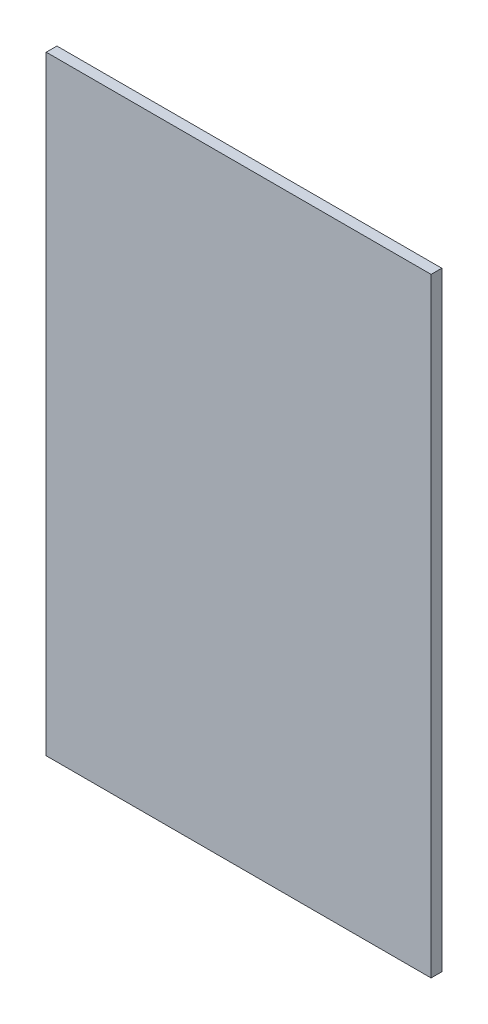
ISO-10303-21;
HEADER;
FILE_DESCRIPTION(('STEP AP214'),'2;1');
FILE_NAME('part.step','',(''),(''),'','','');
FILE_SCHEMA(('AUTOMOTIVE_DESIGN { 1 0 10303 214 1 1 1 1 }'));
ENDSEC;
DATA;
#1=APPLICATION_CONTEXT('core data for automotive mechanical design processes');
#2=APPLICATION_PROTOCOL_DEFINITION('international standard','automotive_design',2000,#1);
#3=PRODUCT_CONTEXT('',#1,'mechanical');
#4=PRODUCT('Part','Part','',(#3));
#5=PRODUCT_RELATED_PRODUCT_CATEGORY('part','',(#4));
#6=PRODUCT_DEFINITION_FORMATION('','',#4);
#7=PRODUCT_DEFINITION_CONTEXT('part definition',#1,'design');
#8=PRODUCT_DEFINITION('design','',#6,#7);
#9=PRODUCT_DEFINITION_SHAPE('','',#8);
#10=(LENGTH_UNIT() NAMED_UNIT(*) SI_UNIT(.MILLI.,.METRE.));
#11=(NAMED_UNIT(*) PLANE_ANGLE_UNIT() SI_UNIT($,.RADIAN.));
#12=(NAMED_UNIT(*) SI_UNIT($,.STERADIAN.) SOLID_ANGLE_UNIT());
#13=UNCERTAINTY_MEASURE_WITH_UNIT(LENGTH_MEASURE(1.E-05),#10,'distance_accuracy_value','');
#14=(GEOMETRIC_REPRESENTATION_CONTEXT(3) GLOBAL_UNCERTAINTY_ASSIGNED_CONTEXT((#13)) GLOBAL_UNIT_ASSIGNED_CONTEXT((#10,
#11,#12)) REPRESENTATION_CONTEXT('',''));
#15=CARTESIAN_POINT('',(0.,0.,0.));
#16=DIRECTION('',(0.,0.,1.));
#17=DIRECTION('',(1.,0.,0.));
#18=AXIS2_PLACEMENT_3D('',#15,#16,#17);
#19=CARTESIAN_POINT('',(114.3,-180.975,3.175));
#20=DIRECTION('',(-1.,0.,0.));
#21=DIRECTION('',(0.,0.,1.));
#22=AXIS2_PLACEMENT_3D('',#19,#20,#21);
#23=PLANE('',#22);
#24=DIRECTION('',(0.,1.,0.));
#25=VECTOR('',#24,1.);
#26=CARTESIAN_POINT('',(114.3,-180.975,-3.175));
#27=LINE('',#26,#25);
#28=CARTESIAN_POINT('',(114.3,-180.975,-3.175));
#29=VERTEX_POINT('',#28);
#30=CARTESIAN_POINT('',(114.3,180.975,-3.175));
#31=VERTEX_POINT('',#30);
#32=EDGE_CURVE('E96',#29,#31,#27,.T.);
#33=ORIENTED_EDGE('',*,*,#32,.T.);
#34=DIRECTION('',(0.,0.,-1.));
#35=VECTOR('',#34,1.);
#36=CARTESIAN_POINT('',(114.3,180.975,3.175));
#37=LINE('',#36,#35);
#38=CARTESIAN_POINT('',(114.3,180.975,3.175));
#39=VERTEX_POINT('',#38);
#40=EDGE_CURVE('E11',#39,#31,#37,.T.);
#41=ORIENTED_EDGE('',*,*,#40,.F.);
#42=DIRECTION('',(0.,1.,0.));
#43=VECTOR('',#42,1.);
#44=CARTESIAN_POINT('',(114.3,-180.975,3.175));
#45=LINE('',#44,#43);
#46=CARTESIAN_POINT('',(114.3,-180.975,3.175));
#47=VERTEX_POINT('',#46);
#48=EDGE_CURVE('E84',#47,#39,#45,.T.);
#49=ORIENTED_EDGE('',*,*,#48,.F.);
#50=DIRECTION('',(0.,0.,-1.));
#51=VECTOR('',#50,1.);
#52=CARTESIAN_POINT('',(114.3,-180.975,3.175));
#53=LINE('',#52,#51);
#54=EDGE_CURVE('E92',#47,#29,#53,.T.);
#55=ORIENTED_EDGE('',*,*,#54,.T.);
#56=EDGE_LOOP('',(#33,#41,#49,#55));
#57=FACE_BOUND('',#56,.T.);
#58=ADVANCED_FACE('F33',(#57),#23,.F.);
#59=CARTESIAN_POINT('',(-114.3,180.975,3.175));
#60=DIRECTION('',(0.,-1.,0.));
#61=DIRECTION('',(0.,0.,-1.));
#62=AXIS2_PLACEMENT_3D('',#59,#60,#61);
#63=PLANE('',#62);
#64=DIRECTION('',(-1.,0.,0.));
#65=VECTOR('',#64,1.);
#66=CARTESIAN_POINT('',(-114.3,180.975,-3.175));
#67=LINE('',#66,#65);
#68=CARTESIAN_POINT('',(-114.3,180.975,-3.175));
#69=VERTEX_POINT('',#68);
#70=EDGE_CURVE('E88',#31,#69,#67,.T.);
#71=ORIENTED_EDGE('',*,*,#70,.T.);
#72=DIRECTION('',(0.,0.,-1.));
#73=VECTOR('',#72,1.);
#74=CARTESIAN_POINT('',(-114.3,180.975,3.175));
#75=LINE('',#74,#73);
#76=CARTESIAN_POINT('',(-114.3,180.975,3.175));
#77=VERTEX_POINT('',#76);
#78=EDGE_CURVE('E41',#77,#69,#75,.T.);
#79=ORIENTED_EDGE('',*,*,#78,.F.);
#80=DIRECTION('',(-1.,0.,0.));
#81=VECTOR('',#80,1.);
#82=CARTESIAN_POINT('',(-114.3,180.975,3.175));
#83=LINE('',#82,#81);
#84=EDGE_CURVE('E79',#39,#77,#83,.T.);
#85=ORIENTED_EDGE('',*,*,#84,.F.);
#86=ORIENTED_EDGE('',*,*,#40,.T.);
#87=EDGE_LOOP('',(#71,#79,#85,#86));
#88=FACE_BOUND('',#87,.T.);
#89=ADVANCED_FACE('F87',(#88),#63,.F.);
#90=CARTESIAN_POINT('',(-114.3,-180.975,3.175));
#91=DIRECTION('',(1.,0.,0.));
#92=DIRECTION('',(0.,0.,-1.));
#93=AXIS2_PLACEMENT_3D('',#90,#91,#92);
#94=PLANE('',#93);
#95=DIRECTION('',(0.,-1.,0.));
#96=VECTOR('',#95,1.);
#97=CARTESIAN_POINT('',(-114.3,-180.975,-3.175));
#98=LINE('',#97,#96);
#99=CARTESIAN_POINT('',(-114.3,-180.975,-3.175));
#100=VERTEX_POINT('',#99);
#101=EDGE_CURVE('E66',#69,#100,#98,.T.);
#102=ORIENTED_EDGE('',*,*,#101,.T.);
#103=DIRECTION('',(0.,0.,-1.));
#104=VECTOR('',#103,1.);
#105=CARTESIAN_POINT('',(-114.3,-180.975,3.175));
#106=LINE('',#105,#104);
#107=CARTESIAN_POINT('',(-114.3,-180.975,3.175));
#108=VERTEX_POINT('',#107);
#109=EDGE_CURVE('E89',#108,#100,#106,.T.);
#110=ORIENTED_EDGE('',*,*,#109,.F.);
#111=DIRECTION('',(0.,-1.,0.));
#112=VECTOR('',#111,1.);
#113=CARTESIAN_POINT('',(-114.3,-180.975,3.175));
#114=LINE('',#113,#112);
#115=EDGE_CURVE('E82',#77,#108,#114,.T.);
#116=ORIENTED_EDGE('',*,*,#115,.F.);
#117=ORIENTED_EDGE('',*,*,#78,.T.);
#118=EDGE_LOOP('',(#102,#110,#116,#117));
#119=FACE_BOUND('',#118,.T.);
#120=ADVANCED_FACE('F90',(#119),#94,.F.);
#121=CARTESIAN_POINT('',(-114.3,-180.975,3.175));
#122=DIRECTION('',(0.,1.,0.));
#123=DIRECTION('',(0.,0.,1.));
#124=AXIS2_PLACEMENT_3D('',#121,#122,#123);
#125=PLANE('',#124);
#126=DIRECTION('',(1.,0.,0.));
#127=VECTOR('',#126,1.);
#128=CARTESIAN_POINT('',(-114.3,-180.975,-3.175));
#129=LINE('',#128,#127);
#130=EDGE_CURVE('E72',#100,#29,#129,.T.);
#131=ORIENTED_EDGE('',*,*,#130,.T.);
#132=ORIENTED_EDGE('',*,*,#54,.F.);
#133=DIRECTION('',(1.,0.,0.));
#134=VECTOR('',#133,1.);
#135=CARTESIAN_POINT('',(-114.3,-180.975,3.175));
#136=LINE('',#135,#134);
#137=EDGE_CURVE('E49',#108,#47,#136,.T.);
#138=ORIENTED_EDGE('',*,*,#137,.F.);
#139=ORIENTED_EDGE('',*,*,#109,.T.);
#140=EDGE_LOOP('',(#131,#132,#138,#139));
#141=FACE_BOUND('',#140,.T.);
#142=ADVANCED_FACE('F103',(#141),#125,.F.);
#143=CARTESIAN_POINT('',(0.,0.,3.175));
#144=DIRECTION('',(0.,0.,-1.));
#145=DIRECTION('',(-1.,0.,0.));
#146=AXIS2_PLACEMENT_3D('',#143,#144,#145);
#147=PLANE('',#146);
#148=ORIENTED_EDGE('',*,*,#48,.T.);
#149=ORIENTED_EDGE('',*,*,#84,.T.);
#150=ORIENTED_EDGE('',*,*,#115,.T.);
#151=ORIENTED_EDGE('',*,*,#137,.T.);
#152=EDGE_LOOP('',(#148,#149,#150,#151));
#153=FACE_BOUND('',#152,.T.);
#154=ADVANCED_FACE('F80',(#153),#147,.F.);
#155=CARTESIAN_POINT('',(0.,0.,-3.175));
#156=DIRECTION('',(0.,0.,-1.));
#157=DIRECTION('',(-1.,0.,0.));
#158=AXIS2_PLACEMENT_3D('',#155,#156,#157);
#159=PLANE('',#158);
#160=ORIENTED_EDGE('',*,*,#32,.F.);
#161=ORIENTED_EDGE('',*,*,#130,.F.);
#162=ORIENTED_EDGE('',*,*,#101,.F.);
#163=ORIENTED_EDGE('',*,*,#70,.F.);
#164=EDGE_LOOP('',(#160,#161,#162,#163));
#165=FACE_BOUND('',#164,.T.);
#166=ADVANCED_FACE('F106',(#165),#159,.T.);
#167=CLOSED_SHELL('',(#58,#89,#120,#142,#154,#166));
#168=MANIFOLD_SOLID_BREP('B2',#167);
#169=ADVANCED_BREP_SHAPE_REPRESENTATION('',(#18,#168),#14);
#170=SHAPE_DEFINITION_REPRESENTATION(#9,#169);
ENDSEC;
END-ISO-10303-21;
